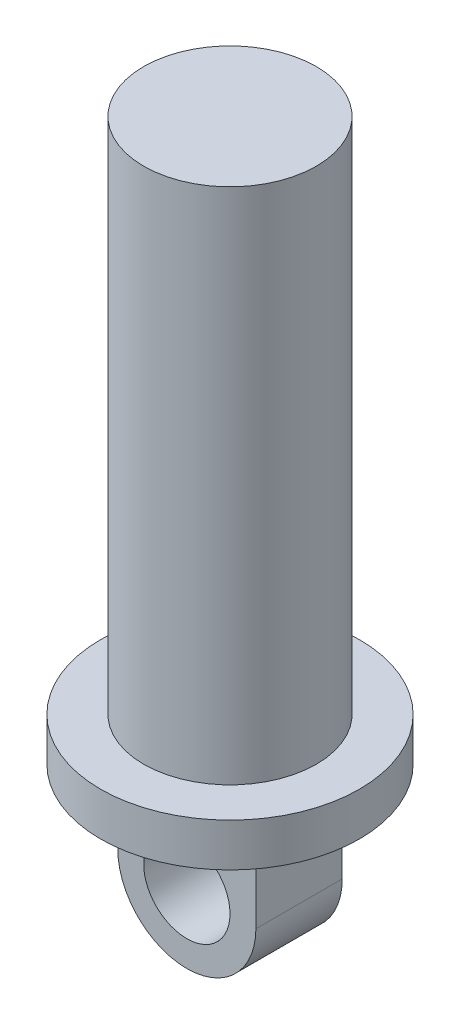
ISO-10303-21;
HEADER;
FILE_DESCRIPTION(('STEP AP214'),'2;1');
FILE_NAME('part.step','',(''),(''),'','','');
FILE_SCHEMA(('AUTOMOTIVE_DESIGN { 1 0 10303 214 1 1 1 1 }'));
ENDSEC;
DATA;
#1=APPLICATION_CONTEXT('core data for automotive mechanical design processes');
#2=APPLICATION_PROTOCOL_DEFINITION('international standard','automotive_design',2000,#1);
#3=PRODUCT_CONTEXT('',#1,'mechanical');
#4=PRODUCT('Part','Part','',(#3));
#5=PRODUCT_RELATED_PRODUCT_CATEGORY('part','',(#4));
#6=PRODUCT_DEFINITION_FORMATION('','',#4);
#7=PRODUCT_DEFINITION_CONTEXT('part definition',#1,'design');
#8=PRODUCT_DEFINITION('design','',#6,#7);
#9=PRODUCT_DEFINITION_SHAPE('','',#8);
#10=(LENGTH_UNIT() NAMED_UNIT(*) SI_UNIT(.MILLI.,.METRE.));
#11=(NAMED_UNIT(*) PLANE_ANGLE_UNIT() SI_UNIT($,.RADIAN.));
#12=(NAMED_UNIT(*) SI_UNIT($,.STERADIAN.) SOLID_ANGLE_UNIT());
#13=UNCERTAINTY_MEASURE_WITH_UNIT(LENGTH_MEASURE(1.E-05),#10,'distance_accuracy_value','');
#14=(GEOMETRIC_REPRESENTATION_CONTEXT(3) GLOBAL_UNCERTAINTY_ASSIGNED_CONTEXT((#13)) GLOBAL_UNIT_ASSIGNED_CONTEXT((#10,
#11,#12)) REPRESENTATION_CONTEXT('',''));
#15=CARTESIAN_POINT('',(0.,0.,0.));
#16=DIRECTION('',(0.,0.,1.));
#17=DIRECTION('',(1.,0.,0.));
#18=AXIS2_PLACEMENT_3D('',#15,#16,#17);
#19=CARTESIAN_POINT('',(-4.,0.,-2.5));
#20=DIRECTION('',(-1.,0.,0.));
#21=DIRECTION('',(0.,0.,-1.));
#22=AXIS2_PLACEMENT_3D('',#19,#20,#21);
#23=PLANE('',#22);
#24=DIRECTION('',(0.,1.,0.));
#25=VECTOR('',#24,1.);
#26=CARTESIAN_POINT('',(-4.,0.,2.5));
#27=LINE('',#26,#25);
#28=CARTESIAN_POINT('',(-4.,0.,2.5));
#29=VERTEX_POINT('',#28);
#30=CARTESIAN_POINT('',(-4.,5.,2.5));
#31=VERTEX_POINT('',#30);
#32=EDGE_CURVE('E105',#29,#31,#27,.T.);
#33=ORIENTED_EDGE('',*,*,#32,.T.);
#34=DIRECTION('',(0.,0.,1.));
#35=VECTOR('',#34,1.);
#36=CARTESIAN_POINT('',(-4.,5.,-2.5));
#37=LINE('',#36,#35);
#38=CARTESIAN_POINT('',(-4.,5.,-2.5));
#39=VERTEX_POINT('',#38);
#40=EDGE_CURVE('E93',#39,#31,#37,.T.);
#41=ORIENTED_EDGE('',*,*,#40,.F.);
#42=DIRECTION('',(0.,1.,0.));
#43=VECTOR('',#42,1.);
#44=CARTESIAN_POINT('',(-4.,0.,-2.5));
#45=LINE('',#44,#43);
#46=CARTESIAN_POINT('',(-4.,0.,-2.5));
#47=VERTEX_POINT('',#46);
#48=EDGE_CURVE('E113',#47,#39,#45,.T.);
#49=ORIENTED_EDGE('',*,*,#48,.F.);
#50=DIRECTION('',(0.,0.,1.));
#51=VECTOR('',#50,1.);
#52=CARTESIAN_POINT('',(-4.,0.,-2.5));
#53=LINE('',#52,#51);
#54=EDGE_CURVE('E43',#47,#29,#53,.T.);
#55=ORIENTED_EDGE('',*,*,#54,.T.);
#56=EDGE_LOOP('',(#33,#41,#49,#55));
#57=FACE_BOUND('',#56,.T.);
#58=ADVANCED_FACE('F39',(#57),#23,.T.);
#59=CARTESIAN_POINT('',(0.,0.,-2.5));
#60=DIRECTION('',(0.,0.,1.));
#61=DIRECTION('',(-1.,0.,0.));
#62=AXIS2_PLACEMENT_3D('',#59,#60,#61);
#63=CYLINDRICAL_SURFACE('',#62,4.);
#64=CARTESIAN_POINT('',(0.,0.,2.5));
#65=DIRECTION('',(0.,0.,1.));
#66=DIRECTION('',(1.,0.,0.));
#67=AXIS2_PLACEMENT_3D('',#64,#65,#66);
#68=CIRCLE('',#67,4.);
#69=CARTESIAN_POINT('',(4.,0.,2.5));
#70=VERTEX_POINT('',#69);
#71=EDGE_CURVE('E103',#29,#70,#68,.T.);
#72=ORIENTED_EDGE('',*,*,#71,.F.);
#73=ORIENTED_EDGE('',*,*,#54,.F.);
#74=CARTESIAN_POINT('',(0.,0.,-2.5));
#75=DIRECTION('',(0.,0.,1.));
#76=DIRECTION('',(1.,0.,0.));
#77=AXIS2_PLACEMENT_3D('',#74,#75,#76);
#78=CIRCLE('',#77,4.);
#79=CARTESIAN_POINT('',(4.,0.,-2.5));
#80=VERTEX_POINT('',#79);
#81=EDGE_CURVE('E85',#47,#80,#78,.T.);
#82=ORIENTED_EDGE('',*,*,#81,.T.);
#83=DIRECTION('',(0.,0.,1.));
#84=VECTOR('',#83,1.);
#85=CARTESIAN_POINT('',(4.,0.,-2.5));
#86=LINE('',#85,#84);
#87=EDGE_CURVE('E99',#80,#70,#86,.T.);
#88=ORIENTED_EDGE('',*,*,#87,.T.);
#89=EDGE_LOOP('',(#72,#73,#82,#88));
#90=FACE_BOUND('',#89,.T.);
#91=ADVANCED_FACE('F145',(#90),#63,.T.);
#92=CARTESIAN_POINT('',(4.,0.,-2.5));
#93=DIRECTION('',(-1.,0.,0.));
#94=DIRECTION('',(0.,0.,-1.));
#95=AXIS2_PLACEMENT_3D('',#92,#93,#94);
#96=PLANE('',#95);
#97=DIRECTION('',(0.,1.,0.));
#98=VECTOR('',#97,1.);
#99=CARTESIAN_POINT('',(4.,0.,2.5));
#100=LINE('',#99,#98);
#101=CARTESIAN_POINT('',(4.,5.,2.5));
#102=VERTEX_POINT('',#101);
#103=EDGE_CURVE('E72',#70,#102,#100,.T.);
#104=ORIENTED_EDGE('',*,*,#103,.F.);
#105=ORIENTED_EDGE('',*,*,#87,.F.);
#106=DIRECTION('',(0.,1.,0.));
#107=VECTOR('',#106,1.);
#108=CARTESIAN_POINT('',(4.,0.,-2.5));
#109=LINE('',#108,#107);
#110=CARTESIAN_POINT('',(4.,5.,-2.5));
#111=VERTEX_POINT('',#110);
#112=EDGE_CURVE('E98',#80,#111,#109,.T.);
#113=ORIENTED_EDGE('',*,*,#112,.T.);
#114=DIRECTION('',(0.,0.,1.));
#115=VECTOR('',#114,1.);
#116=CARTESIAN_POINT('',(4.,5.,-2.5));
#117=LINE('',#116,#115);
#118=EDGE_CURVE('E90',#111,#102,#117,.T.);
#119=ORIENTED_EDGE('',*,*,#118,.T.);
#120=EDGE_LOOP('',(#104,#105,#113,#119));
#121=FACE_BOUND('',#120,.T.);
#122=ADVANCED_FACE('F97',(#121),#96,.F.);
#123=CARTESIAN_POINT('',(0.,0.,-2.5));
#124=DIRECTION('',(0.,0.,1.));
#125=DIRECTION('',(-1.,0.,0.));
#126=AXIS2_PLACEMENT_3D('',#123,#124,#125);
#127=CYLINDRICAL_SURFACE('',#126,2.5);
#128=CARTESIAN_POINT('',(0.,0.,-2.5));
#129=DIRECTION('',(0.,0.,1.));
#130=DIRECTION('',(1.,0.,0.));
#131=AXIS2_PLACEMENT_3D('',#128,#129,#130);
#132=CIRCLE('',#131,2.5);
#133=CARTESIAN_POINT('',(2.5,0.,-2.5));
#134=VERTEX_POINT('',#133);
#135=EDGE_CURVE('E95',#134,#134,#132,.T.);
#136=ORIENTED_EDGE('',*,*,#135,.F.);
#137=EDGE_LOOP('',(#136));
#138=FACE_BOUND('',#137,.T.);
#139=CARTESIAN_POINT('',(0.,0.,2.5));
#140=DIRECTION('',(0.,0.,1.));
#141=DIRECTION('',(1.,0.,0.));
#142=AXIS2_PLACEMENT_3D('',#139,#140,#141);
#143=CIRCLE('',#142,2.5);
#144=CARTESIAN_POINT('',(2.5,0.,2.5));
#145=VERTEX_POINT('',#144);
#146=EDGE_CURVE('E114',#145,#145,#143,.T.);
#147=ORIENTED_EDGE('',*,*,#146,.T.);
#148=EDGE_LOOP('',(#147));
#149=FACE_BOUND('',#148,.T.);
#150=ADVANCED_FACE('F41',(#138,#149),#127,.F.);
#151=CARTESIAN_POINT('',(0.,0.,-2.5));
#152=DIRECTION('',(0.,0.,-1.));
#153=DIRECTION('',(1.,0.,0.));
#154=AXIS2_PLACEMENT_3D('',#151,#152,#153);
#155=PLANE('',#154);
#156=ORIENTED_EDGE('',*,*,#135,.T.);
#157=EDGE_LOOP('',(#156));
#158=FACE_BOUND('',#157,.T.);
#159=ORIENTED_EDGE('',*,*,#48,.T.);
#160=DIRECTION('',(1.,0.,0.));
#161=VECTOR('',#160,1.);
#162=CARTESIAN_POINT('',(0.,5.,-2.5));
#163=LINE('',#162,#161);
#164=EDGE_CURVE('E57',#39,#111,#163,.T.);
#165=ORIENTED_EDGE('',*,*,#164,.T.);
#166=ORIENTED_EDGE('',*,*,#112,.F.);
#167=ORIENTED_EDGE('',*,*,#81,.F.);
#168=EDGE_LOOP('',(#159,#165,#166,#167));
#169=FACE_BOUND('',#168,.T.);
#170=ADVANCED_FACE('F156',(#158,#169),#155,.T.);
#171=CARTESIAN_POINT('',(0.,0.,2.5));
#172=DIRECTION('',(0.,0.,-1.));
#173=DIRECTION('',(1.,0.,0.));
#174=AXIS2_PLACEMENT_3D('',#171,#172,#173);
#175=PLANE('',#174);
#176=ORIENTED_EDGE('',*,*,#146,.F.);
#177=EDGE_LOOP('',(#176));
#178=FACE_BOUND('',#177,.T.);
#179=ORIENTED_EDGE('',*,*,#32,.F.);
#180=ORIENTED_EDGE('',*,*,#71,.T.);
#181=ORIENTED_EDGE('',*,*,#103,.T.);
#182=DIRECTION('',(1.,0.,0.));
#183=VECTOR('',#182,1.);
#184=CARTESIAN_POINT('',(0.,5.,2.5));
#185=LINE('',#184,#183);
#186=EDGE_CURVE('E79',#31,#102,#185,.T.);
#187=ORIENTED_EDGE('',*,*,#186,.F.);
#188=EDGE_LOOP('',(#179,#180,#181,#187));
#189=FACE_BOUND('',#188,.T.);
#190=ADVANCED_FACE('F102',(#178,#189),#175,.F.);
#191=CARTESIAN_POINT('',(0.,7.5,0.));
#192=DIRECTION('',(0.,-1.,0.));
#193=DIRECTION('',(0.,0.,1.));
#194=AXIS2_PLACEMENT_3D('',#191,#192,#193);
#195=CYLINDRICAL_SURFACE('',#194,7.5);
#196=CARTESIAN_POINT('',(0.,7.5,0.));
#197=DIRECTION('',(0.,-1.,0.));
#198=DIRECTION('',(0.,0.,-1.));
#199=AXIS2_PLACEMENT_3D('',#196,#197,#198);
#200=CIRCLE('',#199,7.5);
#201=CARTESIAN_POINT('',(0.,7.5,-7.5));
#202=VERTEX_POINT('',#201);
#203=EDGE_CURVE('E116',#202,#202,#200,.T.);
#204=ORIENTED_EDGE('',*,*,#203,.T.);
#205=EDGE_LOOP('',(#204));
#206=FACE_BOUND('',#205,.T.);
#207=CARTESIAN_POINT('',(0.,5.,0.));
#208=DIRECTION('',(0.,-1.,0.));
#209=DIRECTION('',(0.,0.,-1.));
#210=AXIS2_PLACEMENT_3D('',#207,#208,#209);
#211=CIRCLE('',#210,7.5);
#212=CARTESIAN_POINT('',(0.,5.,-7.5));
#213=VERTEX_POINT('',#212);
#214=EDGE_CURVE('E125',#213,#213,#211,.T.);
#215=ORIENTED_EDGE('',*,*,#214,.F.);
#216=EDGE_LOOP('',(#215));
#217=FACE_BOUND('',#216,.T.);
#218=ADVANCED_FACE('F155',(#206,#217),#195,.T.);
#219=CARTESIAN_POINT('',(0.,7.5,0.));
#220=DIRECTION('',(0.,1.,0.));
#221=DIRECTION('',(0.,0.,-1.));
#222=AXIS2_PLACEMENT_3D('',#219,#220,#221);
#223=PLANE('',#222);
#224=CARTESIAN_POINT('',(0.,7.5,0.));
#225=DIRECTION('',(0.,-1.,0.));
#226=DIRECTION('',(0.,0.,-1.));
#227=AXIS2_PLACEMENT_3D('',#224,#225,#226);
#228=CIRCLE('',#227,5.);
#229=CARTESIAN_POINT('',(0.,7.5,-5.));
#230=VERTEX_POINT('',#229);
#231=EDGE_CURVE('E11',#230,#230,#228,.T.);
#232=ORIENTED_EDGE('',*,*,#231,.T.);
#233=EDGE_LOOP('',(#232));
#234=FACE_BOUND('',#233,.T.);
#235=ORIENTED_EDGE('',*,*,#203,.F.);
#236=EDGE_LOOP('',(#235));
#237=FACE_BOUND('',#236,.T.);
#238=ADVANCED_FACE('F163',(#234,#237),#223,.T.);
#239=CARTESIAN_POINT('',(0.,5.,0.));
#240=DIRECTION('',(0.,1.,0.));
#241=DIRECTION('',(0.,0.,-1.));
#242=AXIS2_PLACEMENT_3D('',#239,#240,#241);
#243=PLANE('',#242);
#244=ORIENTED_EDGE('',*,*,#186,.T.);
#245=ORIENTED_EDGE('',*,*,#118,.F.);
#246=ORIENTED_EDGE('',*,*,#164,.F.);
#247=ORIENTED_EDGE('',*,*,#40,.T.);
#248=EDGE_LOOP('',(#244,#245,#246,#247));
#249=FACE_BOUND('',#248,.T.);
#250=ORIENTED_EDGE('',*,*,#214,.T.);
#251=EDGE_LOOP('',(#250));
#252=FACE_BOUND('',#251,.T.);
#253=ADVANCED_FACE('F88',(#249,#252),#243,.F.);
#254=CARTESIAN_POINT('',(0.,37.5,0.));
#255=DIRECTION('',(0.,-1.,0.));
#256=DIRECTION('',(0.,0.,1.));
#257=AXIS2_PLACEMENT_3D('',#254,#255,#256);
#258=CYLINDRICAL_SURFACE('',#257,5.);
#259=CARTESIAN_POINT('',(0.,37.5,0.));
#260=DIRECTION('',(0.,-1.,0.));
#261=DIRECTION('',(0.,0.,-1.));
#262=AXIS2_PLACEMENT_3D('',#259,#260,#261);
#263=CIRCLE('',#262,5.);
#264=CARTESIAN_POINT('',(0.,37.5,-5.));
#265=VERTEX_POINT('',#264);
#266=EDGE_CURVE('E128',#265,#265,#263,.T.);
#267=ORIENTED_EDGE('',*,*,#266,.T.);
#268=EDGE_LOOP('',(#267));
#269=FACE_BOUND('',#268,.T.);
#270=ORIENTED_EDGE('',*,*,#231,.F.);
#271=EDGE_LOOP('',(#270));
#272=FACE_BOUND('',#271,.T.);
#273=ADVANCED_FACE('F134',(#269,#272),#258,.T.);
#274=CARTESIAN_POINT('',(0.,37.5,0.));
#275=DIRECTION('',(0.,1.,0.));
#276=DIRECTION('',(0.,0.,-1.));
#277=AXIS2_PLACEMENT_3D('',#274,#275,#276);
#278=PLANE('',#277);
#279=ORIENTED_EDGE('',*,*,#266,.F.);
#280=EDGE_LOOP('',(#279));
#281=FACE_BOUND('',#280,.T.);
#282=ADVANCED_FACE('F137',(#281),#278,.T.);
#283=CLOSED_SHELL('',(#58,#91,#122,#150,#170,#190,#218,#238,#253,#273,#282));
#284=MANIFOLD_SOLID_BREP('B2',#283);
#285=ADVANCED_BREP_SHAPE_REPRESENTATION('',(#18,#284),#14);
#286=SHAPE_DEFINITION_REPRESENTATION(#9,#285);
ENDSEC;
END-ISO-10303-21;
